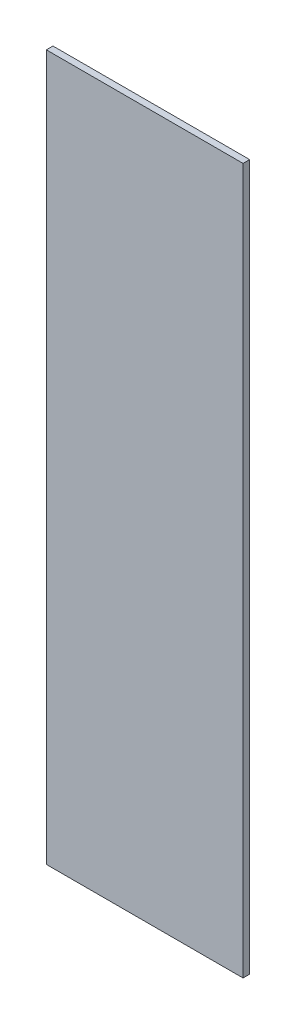
ISO-10303-21;
HEADER;
FILE_DESCRIPTION(('STEP AP214'),'2;1');
FILE_NAME('part.step','',(''),(''),'','','');
FILE_SCHEMA(('AUTOMOTIVE_DESIGN { 1 0 10303 214 1 1 1 1 }'));
ENDSEC;
DATA;
#1=APPLICATION_CONTEXT('core data for automotive mechanical design processes');
#2=APPLICATION_PROTOCOL_DEFINITION('international standard','automotive_design',2000,#1);
#3=PRODUCT_CONTEXT('',#1,'mechanical');
#4=PRODUCT('Part','Part','',(#3));
#5=PRODUCT_RELATED_PRODUCT_CATEGORY('part','',(#4));
#6=PRODUCT_DEFINITION_FORMATION('','',#4);
#7=PRODUCT_DEFINITION_CONTEXT('part definition',#1,'design');
#8=PRODUCT_DEFINITION('design','',#6,#7);
#9=PRODUCT_DEFINITION_SHAPE('','',#8);
#10=(LENGTH_UNIT() NAMED_UNIT(*) SI_UNIT(.MILLI.,.METRE.));
#11=(NAMED_UNIT(*) PLANE_ANGLE_UNIT() SI_UNIT($,.RADIAN.));
#12=(NAMED_UNIT(*) SI_UNIT($,.STERADIAN.) SOLID_ANGLE_UNIT());
#13=UNCERTAINTY_MEASURE_WITH_UNIT(LENGTH_MEASURE(1.E-05),#10,'distance_accuracy_value','');
#14=(GEOMETRIC_REPRESENTATION_CONTEXT(3) GLOBAL_UNCERTAINTY_ASSIGNED_CONTEXT((#13)) GLOBAL_UNIT_ASSIGNED_CONTEXT((#10,
#11,#12)) REPRESENTATION_CONTEXT('',''));
#15=CARTESIAN_POINT('',(0.,0.,0.));
#16=DIRECTION('',(0.,0.,1.));
#17=DIRECTION('',(1.,0.,0.));
#18=AXIS2_PLACEMENT_3D('',#15,#16,#17);
#19=CARTESIAN_POINT('',(0.,533.,0.));
#20=DIRECTION('',(1.,0.,0.));
#21=DIRECTION('',(0.,0.,-1.));
#22=AXIS2_PLACEMENT_3D('',#19,#20,#21);
#23=PLANE('',#22);
#24=DIRECTION('',(0.,0.,1.));
#25=VECTOR('',#24,1.);
#26=CARTESIAN_POINT('',(0.,0.,0.));
#27=LINE('',#26,#25);
#28=CARTESIAN_POINT('',(0.,0.,0.));
#29=VERTEX_POINT('',#28);
#30=CARTESIAN_POINT('',(0.,0.,5.));
#31=VERTEX_POINT('',#30);
#32=EDGE_CURVE('E96',#29,#31,#27,.T.);
#33=ORIENTED_EDGE('',*,*,#32,.T.);
#34=DIRECTION('',(0.,-1.,0.));
#35=VECTOR('',#34,1.);
#36=CARTESIAN_POINT('',(0.,533.,5.));
#37=LINE('',#36,#35);
#38=CARTESIAN_POINT('',(0.,533.,5.));
#39=VERTEX_POINT('',#38);
#40=EDGE_CURVE('E11',#39,#31,#37,.T.);
#41=ORIENTED_EDGE('',*,*,#40,.F.);
#42=DIRECTION('',(0.,0.,1.));
#43=VECTOR('',#42,1.);
#44=CARTESIAN_POINT('',(0.,533.,0.));
#45=LINE('',#44,#43);
#46=CARTESIAN_POINT('',(0.,533.,0.));
#47=VERTEX_POINT('',#46);
#48=EDGE_CURVE('E84',#47,#39,#45,.T.);
#49=ORIENTED_EDGE('',*,*,#48,.F.);
#50=DIRECTION('',(0.,-1.,0.));
#51=VECTOR('',#50,1.);
#52=CARTESIAN_POINT('',(0.,533.,0.));
#53=LINE('',#52,#51);
#54=EDGE_CURVE('E92',#47,#29,#53,.T.);
#55=ORIENTED_EDGE('',*,*,#54,.T.);
#56=EDGE_LOOP('',(#33,#41,#49,#55));
#57=FACE_BOUND('',#56,.T.);
#58=ADVANCED_FACE('F33',(#57),#23,.F.);
#59=CARTESIAN_POINT('',(0.,533.,5.));
#60=DIRECTION('',(0.,0.,-1.));
#61=DIRECTION('',(-1.,0.,0.));
#62=AXIS2_PLACEMENT_3D('',#59,#60,#61);
#63=PLANE('',#62);
#64=DIRECTION('',(1.,0.,0.));
#65=VECTOR('',#64,1.);
#66=CARTESIAN_POINT('',(0.,0.,5.));
#67=LINE('',#66,#65);
#68=CARTESIAN_POINT('',(148.63,0.,5.));
#69=VERTEX_POINT('',#68);
#70=EDGE_CURVE('E88',#31,#69,#67,.T.);
#71=ORIENTED_EDGE('',*,*,#70,.T.);
#72=DIRECTION('',(0.,-1.,0.));
#73=VECTOR('',#72,1.);
#74=CARTESIAN_POINT('',(148.63,533.,5.));
#75=LINE('',#74,#73);
#76=CARTESIAN_POINT('',(148.63,533.,5.));
#77=VERTEX_POINT('',#76);
#78=EDGE_CURVE('E41',#77,#69,#75,.T.);
#79=ORIENTED_EDGE('',*,*,#78,.F.);
#80=DIRECTION('',(1.,0.,0.));
#81=VECTOR('',#80,1.);
#82=CARTESIAN_POINT('',(0.,533.,5.));
#83=LINE('',#82,#81);
#84=EDGE_CURVE('E79',#39,#77,#83,.T.);
#85=ORIENTED_EDGE('',*,*,#84,.F.);
#86=ORIENTED_EDGE('',*,*,#40,.T.);
#87=EDGE_LOOP('',(#71,#79,#85,#86));
#88=FACE_BOUND('',#87,.T.);
#89=ADVANCED_FACE('F87',(#88),#63,.F.);
#90=CARTESIAN_POINT('',(148.63,533.,0.));
#91=DIRECTION('',(-1.,0.,0.));
#92=DIRECTION('',(0.,0.,1.));
#93=AXIS2_PLACEMENT_3D('',#90,#91,#92);
#94=PLANE('',#93);
#95=DIRECTION('',(0.,0.,-1.));
#96=VECTOR('',#95,1.);
#97=CARTESIAN_POINT('',(148.63,0.,0.));
#98=LINE('',#97,#96);
#99=CARTESIAN_POINT('',(148.63,0.,0.));
#100=VERTEX_POINT('',#99);
#101=EDGE_CURVE('E66',#69,#100,#98,.T.);
#102=ORIENTED_EDGE('',*,*,#101,.T.);
#103=DIRECTION('',(0.,-1.,0.));
#104=VECTOR('',#103,1.);
#105=CARTESIAN_POINT('',(148.63,533.,0.));
#106=LINE('',#105,#104);
#107=CARTESIAN_POINT('',(148.63,533.,0.));
#108=VERTEX_POINT('',#107);
#109=EDGE_CURVE('E89',#108,#100,#106,.T.);
#110=ORIENTED_EDGE('',*,*,#109,.F.);
#111=DIRECTION('',(0.,0.,-1.));
#112=VECTOR('',#111,1.);
#113=CARTESIAN_POINT('',(148.63,533.,0.));
#114=LINE('',#113,#112);
#115=EDGE_CURVE('E82',#77,#108,#114,.T.);
#116=ORIENTED_EDGE('',*,*,#115,.F.);
#117=ORIENTED_EDGE('',*,*,#78,.T.);
#118=EDGE_LOOP('',(#102,#110,#116,#117));
#119=FACE_BOUND('',#118,.T.);
#120=ADVANCED_FACE('F90',(#119),#94,.F.);
#121=CARTESIAN_POINT('',(0.,533.,0.));
#122=DIRECTION('',(0.,0.,1.));
#123=DIRECTION('',(1.,0.,0.));
#124=AXIS2_PLACEMENT_3D('',#121,#122,#123);
#125=PLANE('',#124);
#126=DIRECTION('',(-1.,0.,0.));
#127=VECTOR('',#126,1.);
#128=CARTESIAN_POINT('',(0.,0.,0.));
#129=LINE('',#128,#127);
#130=EDGE_CURVE('E72',#100,#29,#129,.T.);
#131=ORIENTED_EDGE('',*,*,#130,.T.);
#132=ORIENTED_EDGE('',*,*,#54,.F.);
#133=DIRECTION('',(-1.,0.,0.));
#134=VECTOR('',#133,1.);
#135=CARTESIAN_POINT('',(0.,533.,0.));
#136=LINE('',#135,#134);
#137=EDGE_CURVE('E49',#108,#47,#136,.T.);
#138=ORIENTED_EDGE('',*,*,#137,.F.);
#139=ORIENTED_EDGE('',*,*,#109,.T.);
#140=EDGE_LOOP('',(#131,#132,#138,#139));
#141=FACE_BOUND('',#140,.T.);
#142=ADVANCED_FACE('F103',(#141),#125,.F.);
#143=CARTESIAN_POINT('',(0.,533.,5.));
#144=DIRECTION('',(0.,1.,0.));
#145=DIRECTION('',(0.,0.,1.));
#146=AXIS2_PLACEMENT_3D('',#143,#144,#145);
#147=PLANE('',#146);
#148=ORIENTED_EDGE('',*,*,#48,.T.);
#149=ORIENTED_EDGE('',*,*,#84,.T.);
#150=ORIENTED_EDGE('',*,*,#115,.T.);
#151=ORIENTED_EDGE('',*,*,#137,.T.);
#152=EDGE_LOOP('',(#148,#149,#150,#151));
#153=FACE_BOUND('',#152,.T.);
#154=ADVANCED_FACE('F80',(#153),#147,.T.);
#155=CARTESIAN_POINT('',(0.,0.,5.));
#156=DIRECTION('',(0.,1.,0.));
#157=DIRECTION('',(0.,0.,1.));
#158=AXIS2_PLACEMENT_3D('',#155,#156,#157);
#159=PLANE('',#158);
#160=ORIENTED_EDGE('',*,*,#32,.F.);
#161=ORIENTED_EDGE('',*,*,#130,.F.);
#162=ORIENTED_EDGE('',*,*,#101,.F.);
#163=ORIENTED_EDGE('',*,*,#70,.F.);
#164=EDGE_LOOP('',(#160,#161,#162,#163));
#165=FACE_BOUND('',#164,.T.);
#166=ADVANCED_FACE('F106',(#165),#159,.F.);
#167=CLOSED_SHELL('',(#58,#89,#120,#142,#154,#166));
#168=MANIFOLD_SOLID_BREP('B2',#167);
#169=ADVANCED_BREP_SHAPE_REPRESENTATION('',(#18,#168),#14);
#170=SHAPE_DEFINITION_REPRESENTATION(#9,#169);
ENDSEC;
END-ISO-10303-21;
